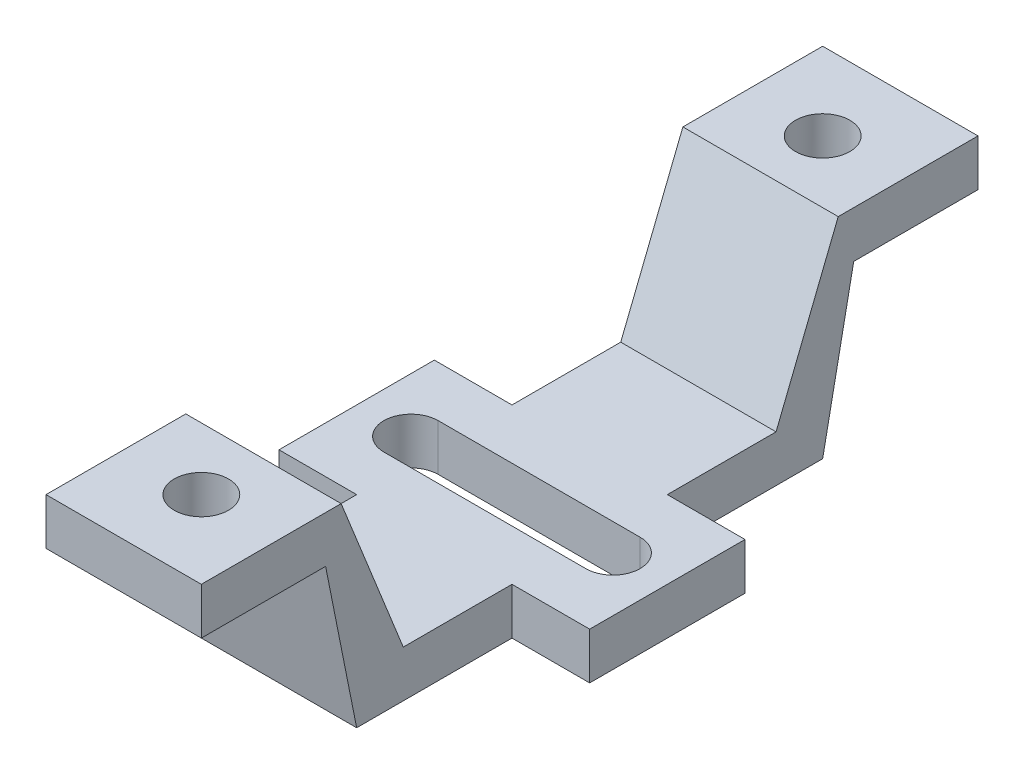
ISO-10303-21;
HEADER;
FILE_DESCRIPTION(('STEP AP214'),'2;1');
FILE_NAME('part.step','',(''),(''),'','','');
FILE_SCHEMA(('AUTOMOTIVE_DESIGN { 1 0 10303 214 1 1 1 1 }'));
ENDSEC;
DATA;
#1=APPLICATION_CONTEXT('core data for automotive mechanical design processes');
#2=APPLICATION_PROTOCOL_DEFINITION('international standard','automotive_design',2000,#1);
#3=PRODUCT_CONTEXT('',#1,'mechanical');
#4=PRODUCT('Part','Part','',(#3));
#5=PRODUCT_RELATED_PRODUCT_CATEGORY('part','',(#4));
#6=PRODUCT_DEFINITION_FORMATION('','',#4);
#7=PRODUCT_DEFINITION_CONTEXT('part definition',#1,'design');
#8=PRODUCT_DEFINITION('design','',#6,#7);
#9=PRODUCT_DEFINITION_SHAPE('','',#8);
#10=(LENGTH_UNIT() NAMED_UNIT(*) SI_UNIT(.MILLI.,.METRE.));
#11=(NAMED_UNIT(*) PLANE_ANGLE_UNIT() SI_UNIT($,.RADIAN.));
#12=(NAMED_UNIT(*) SI_UNIT($,.STERADIAN.) SOLID_ANGLE_UNIT());
#13=UNCERTAINTY_MEASURE_WITH_UNIT(LENGTH_MEASURE(1.E-05),#10,'distance_accuracy_value','');
#14=(GEOMETRIC_REPRESENTATION_CONTEXT(3) GLOBAL_UNCERTAINTY_ASSIGNED_CONTEXT((#13)) GLOBAL_UNIT_ASSIGNED_CONTEXT((#10,
#11,#12)) REPRESENTATION_CONTEXT('',''));
#15=CARTESIAN_POINT('',(0.,0.,0.));
#16=DIRECTION('',(0.,0.,1.));
#17=DIRECTION('',(1.,0.,0.));
#18=AXIS2_PLACEMENT_3D('',#15,#16,#17);
#19=CARTESIAN_POINT('',(0.,3.,-5.));
#20=DIRECTION('',(0.,0.,1.));
#21=DIRECTION('',(1.,0.,0.));
#22=AXIS2_PLACEMENT_3D('',#19,#20,#21);
#23=PLANE('',#22);
#24=DIRECTION('',(0.,1.,0.));
#25=VECTOR('',#24,1.);
#26=CARTESIAN_POINT('',(-5.,0.,-5.));
#27=LINE('',#26,#25);
#28=CARTESIAN_POINT('',(-5.,0.,-5.));
#29=VERTEX_POINT('',#28);
#30=CARTESIAN_POINT('',(-5.,3.,-5.));
#31=VERTEX_POINT('',#30);
#32=EDGE_CURVE('E248',#29,#31,#27,.T.);
#33=ORIENTED_EDGE('',*,*,#32,.F.);
#34=DIRECTION('',(-1.,0.,0.));
#35=VECTOR('',#34,1.);
#36=CARTESIAN_POINT('',(0.,0.,-5.));
#37=LINE('',#36,#35);
#38=CARTESIAN_POINT('',(-10.,0.,-5.));
#39=VERTEX_POINT('',#38);
#40=EDGE_CURVE('E361',#29,#39,#37,.T.);
#41=ORIENTED_EDGE('',*,*,#40,.T.);
#42=DIRECTION('',(0.,-1.,0.));
#43=VECTOR('',#42,1.);
#44=CARTESIAN_POINT('',(-10.,3.,-5.));
#45=LINE('',#44,#43);
#46=CARTESIAN_POINT('',(-10.,3.,-5.));
#47=VERTEX_POINT('',#46);
#48=EDGE_CURVE('E11',#47,#39,#45,.T.);
#49=ORIENTED_EDGE('',*,*,#48,.F.);
#50=DIRECTION('',(-1.,0.,0.));
#51=VECTOR('',#50,1.);
#52=CARTESIAN_POINT('',(0.,3.,-5.));
#53=LINE('',#52,#51);
#54=EDGE_CURVE('E335',#31,#47,#53,.T.);
#55=ORIENTED_EDGE('',*,*,#54,.F.);
#56=EDGE_LOOP('',(#33,#41,#49,#55));
#57=FACE_BOUND('',#56,.T.);
#58=ADVANCED_FACE('F39',(#57),#23,.F.);
#59=CARTESIAN_POINT('',(0.,3.,5.));
#60=DIRECTION('',(0.,0.,1.));
#61=DIRECTION('',(1.,0.,0.));
#62=AXIS2_PLACEMENT_3D('',#59,#60,#61);
#63=PLANE('',#62);
#64=DIRECTION('',(-1.,0.,0.));
#65=VECTOR('',#64,1.);
#66=CARTESIAN_POINT('',(0.,3.,5.));
#67=LINE('',#66,#65);
#68=CARTESIAN_POINT('',(10.,3.,5.));
#69=VERTEX_POINT('',#68);
#70=CARTESIAN_POINT('',(5.,3.,5.));
#71=VERTEX_POINT('',#70);
#72=EDGE_CURVE('E343',#69,#71,#67,.T.);
#73=ORIENTED_EDGE('',*,*,#72,.T.);
#74=DIRECTION('',(0.,-1.,0.));
#75=VECTOR('',#74,1.);
#76=CARTESIAN_POINT('',(5.,0.,5.));
#77=LINE('',#76,#75);
#78=CARTESIAN_POINT('',(5.,0.,5.));
#79=VERTEX_POINT('',#78);
#80=EDGE_CURVE('E277',#71,#79,#77,.T.);
#81=ORIENTED_EDGE('',*,*,#80,.T.);
#82=DIRECTION('',(-1.,0.,0.));
#83=VECTOR('',#82,1.);
#84=CARTESIAN_POINT('',(0.,0.,5.));
#85=LINE('',#84,#83);
#86=CARTESIAN_POINT('',(10.,0.,5.));
#87=VERTEX_POINT('',#86);
#88=EDGE_CURVE('E369',#87,#79,#85,.T.);
#89=ORIENTED_EDGE('',*,*,#88,.F.);
#90=DIRECTION('',(0.,-1.,0.));
#91=VECTOR('',#90,1.);
#92=CARTESIAN_POINT('',(10.,3.,5.));
#93=LINE('',#92,#91);
#94=EDGE_CURVE('E376',#69,#87,#93,.T.);
#95=ORIENTED_EDGE('',*,*,#94,.F.);
#96=EDGE_LOOP('',(#73,#81,#89,#95));
#97=FACE_BOUND('',#96,.T.);
#98=ADVANCED_FACE('F476',(#97),#63,.T.);
#99=CARTESIAN_POINT('',(10.,0.,-5.));
#100=VERTEX_POINT('',#99);
#101=CARTESIAN_POINT('',(5.,0.,-5.));
#102=VERTEX_POINT('',#101);
#103=EDGE_CURVE('E362',#100,#102,#37,.T.);
#104=ORIENTED_EDGE('',*,*,#103,.T.);
#105=DIRECTION('',(0.,1.,0.));
#106=VECTOR('',#105,1.);
#107=CARTESIAN_POINT('',(5.,0.,-5.));
#108=LINE('',#107,#106);
#109=CARTESIAN_POINT('',(5.,3.,-5.));
#110=VERTEX_POINT('',#109);
#111=EDGE_CURVE('E227',#102,#110,#108,.T.);
#112=ORIENTED_EDGE('',*,*,#111,.T.);
#113=CARTESIAN_POINT('',(10.,3.,-5.));
#114=VERTEX_POINT('',#113);
#115=EDGE_CURVE('E336',#114,#110,#53,.T.);
#116=ORIENTED_EDGE('',*,*,#115,.F.);
#117=DIRECTION('',(0.,-1.,0.));
#118=VECTOR('',#117,1.);
#119=CARTESIAN_POINT('',(10.,3.,-5.));
#120=LINE('',#119,#118);
#121=EDGE_CURVE('E374',#114,#100,#120,.T.);
#122=ORIENTED_EDGE('',*,*,#121,.T.);
#123=EDGE_LOOP('',(#104,#112,#116,#122));
#124=FACE_BOUND('',#123,.T.);
#125=ADVANCED_FACE('F415',(#124),#23,.F.);
#126=CARTESIAN_POINT('',(-10.,3.,0.));
#127=DIRECTION('',(1.,0.,0.));
#128=DIRECTION('',(0.,0.,-1.));
#129=AXIS2_PLACEMENT_3D('',#126,#127,#128);
#130=PLANE('',#129);
#131=DIRECTION('',(0.,0.,1.));
#132=VECTOR('',#131,1.);
#133=CARTESIAN_POINT('',(-10.,0.,0.));
#134=LINE('',#133,#132);
#135=CARTESIAN_POINT('',(-9.99999999999999,0.,5.));
#136=VERTEX_POINT('',#135);
#137=EDGE_CURVE('E365',#39,#136,#134,.T.);
#138=ORIENTED_EDGE('',*,*,#137,.T.);
#139=DIRECTION('',(0.,-1.,0.));
#140=VECTOR('',#139,1.);
#141=CARTESIAN_POINT('',(-9.99999999999999,3.,5.));
#142=LINE('',#141,#140);
#143=CARTESIAN_POINT('',(-9.99999999999999,3.,5.));
#144=VERTEX_POINT('',#143);
#145=EDGE_CURVE('E48',#144,#136,#142,.T.);
#146=ORIENTED_EDGE('',*,*,#145,.F.);
#147=DIRECTION('',(0.,0.,1.));
#148=VECTOR('',#147,1.);
#149=CARTESIAN_POINT('',(-10.,3.,0.));
#150=LINE('',#149,#148);
#151=EDGE_CURVE('E339',#47,#144,#150,.T.);
#152=ORIENTED_EDGE('',*,*,#151,.F.);
#153=ORIENTED_EDGE('',*,*,#48,.T.);
#154=EDGE_LOOP('',(#138,#146,#152,#153));
#155=FACE_BOUND('',#154,.T.);
#156=ADVANCED_FACE('F440',(#155),#130,.F.);
#157=DIRECTION('',(0.,-1.,0.));
#158=VECTOR('',#157,1.);
#159=CARTESIAN_POINT('',(-5.,0.,5.));
#160=LINE('',#159,#158);
#161=CARTESIAN_POINT('',(-5.,3.,5.));
#162=VERTEX_POINT('',#161);
#163=CARTESIAN_POINT('',(-5.,0.,5.));
#164=VERTEX_POINT('',#163);
#165=EDGE_CURVE('E297',#162,#164,#160,.T.);
#166=ORIENTED_EDGE('',*,*,#165,.F.);
#167=EDGE_CURVE('E342',#162,#144,#67,.T.);
#168=ORIENTED_EDGE('',*,*,#167,.T.);
#169=ORIENTED_EDGE('',*,*,#145,.T.);
#170=EDGE_CURVE('E368',#164,#136,#85,.T.);
#171=ORIENTED_EDGE('',*,*,#170,.F.);
#172=EDGE_LOOP('',(#166,#168,#169,#171));
#173=FACE_BOUND('',#172,.T.);
#174=ADVANCED_FACE('F446',(#173),#63,.T.);
#175=CARTESIAN_POINT('',(6.5,3.,0.));
#176=DIRECTION('',(0.,-1.,0.));
#177=DIRECTION('',(0.,0.,-1.));
#178=AXIS2_PLACEMENT_3D('',#175,#176,#177);
#179=CYLINDRICAL_SURFACE('',#178,1.75);
#180=CARTESIAN_POINT('',(6.5,0.,0.));
#181=DIRECTION('',(0.,1.,0.));
#182=DIRECTION('',(0.,0.,1.));
#183=AXIS2_PLACEMENT_3D('',#180,#181,#182);
#184=CIRCLE('',#183,1.75);
#185=CARTESIAN_POINT('',(6.5,0.,1.75));
#186=VERTEX_POINT('',#185);
#187=CARTESIAN_POINT('',(6.5,0.,-1.75));
#188=VERTEX_POINT('',#187);
#189=EDGE_CURVE('E323',#186,#188,#184,.T.);
#190=ORIENTED_EDGE('',*,*,#189,.F.);
#191=DIRECTION('',(0.,-1.,0.));
#192=VECTOR('',#191,1.);
#193=CARTESIAN_POINT('',(6.5,3.,1.75));
#194=LINE('',#193,#192);
#195=CARTESIAN_POINT('',(6.5,3.,1.75));
#196=VERTEX_POINT('',#195);
#197=EDGE_CURVE('E377',#196,#186,#194,.T.);
#198=ORIENTED_EDGE('',*,*,#197,.F.);
#199=CARTESIAN_POINT('',(6.5,3.,0.));
#200=DIRECTION('',(0.,1.,0.));
#201=DIRECTION('',(0.,0.,1.));
#202=AXIS2_PLACEMENT_3D('',#199,#200,#201);
#203=CIRCLE('',#202,1.75);
#204=CARTESIAN_POINT('',(6.5,3.,-1.75));
#205=VERTEX_POINT('',#204);
#206=EDGE_CURVE('E324',#196,#205,#203,.T.);
#207=ORIENTED_EDGE('',*,*,#206,.T.);
#208=DIRECTION('',(0.,-1.,0.));
#209=VECTOR('',#208,1.);
#210=CARTESIAN_POINT('',(6.5,3.,-1.75));
#211=LINE('',#210,#209);
#212=EDGE_CURVE('E349',#205,#188,#211,.T.);
#213=ORIENTED_EDGE('',*,*,#212,.T.);
#214=EDGE_LOOP('',(#190,#198,#207,#213));
#215=FACE_BOUND('',#214,.T.);
#216=ADVANCED_FACE('F41',(#215),#179,.F.);
#217=CARTESIAN_POINT('',(0.,3.,1.75));
#218=DIRECTION('',(0.,0.,1.));
#219=DIRECTION('',(1.,0.,0.));
#220=AXIS2_PLACEMENT_3D('',#217,#218,#219);
#221=PLANE('',#220);
#222=DIRECTION('',(-1.,0.,0.));
#223=VECTOR('',#222,1.);
#224=CARTESIAN_POINT('',(0.,0.,1.75));
#225=LINE('',#224,#223);
#226=CARTESIAN_POINT('',(-6.5,0.,1.75));
#227=VERTEX_POINT('',#226);
#228=EDGE_CURVE('E352',#186,#227,#225,.T.);
#229=ORIENTED_EDGE('',*,*,#228,.T.);
#230=DIRECTION('',(0.,-1.,0.));
#231=VECTOR('',#230,1.);
#232=CARTESIAN_POINT('',(-6.5,3.,1.75));
#233=LINE('',#232,#231);
#234=CARTESIAN_POINT('',(-6.5,3.,1.75));
#235=VERTEX_POINT('',#234);
#236=EDGE_CURVE('E384',#235,#227,#233,.T.);
#237=ORIENTED_EDGE('',*,*,#236,.F.);
#238=DIRECTION('',(-1.,0.,0.));
#239=VECTOR('',#238,1.);
#240=CARTESIAN_POINT('',(0.,3.,1.75));
#241=LINE('',#240,#239);
#242=EDGE_CURVE('E327',#196,#235,#241,.T.);
#243=ORIENTED_EDGE('',*,*,#242,.F.);
#244=ORIENTED_EDGE('',*,*,#197,.T.);
#245=EDGE_LOOP('',(#229,#237,#243,#244));
#246=FACE_BOUND('',#245,.T.);
#247=ADVANCED_FACE('F388',(#246),#221,.F.);
#248=CARTESIAN_POINT('',(-6.5,3.,0.));
#249=DIRECTION('',(0.,-1.,0.));
#250=DIRECTION('',(0.,0.,-1.));
#251=AXIS2_PLACEMENT_3D('',#248,#249,#250);
#252=CYLINDRICAL_SURFACE('',#251,1.75);
#253=CARTESIAN_POINT('',(-6.5,0.,0.));
#254=DIRECTION('',(0.,1.,0.));
#255=DIRECTION('',(0.,0.,1.));
#256=AXIS2_PLACEMENT_3D('',#253,#254,#255);
#257=CIRCLE('',#256,1.75);
#258=CARTESIAN_POINT('',(-6.5,0.,-1.75));
#259=VERTEX_POINT('',#258);
#260=EDGE_CURVE('E355',#259,#227,#257,.T.);
#261=ORIENTED_EDGE('',*,*,#260,.F.);
#262=DIRECTION('',(0.,-1.,0.));
#263=VECTOR('',#262,1.);
#264=CARTESIAN_POINT('',(-6.5,3.,-1.75));
#265=LINE('',#264,#263);
#266=CARTESIAN_POINT('',(-6.5,3.,-1.75));
#267=VERTEX_POINT('',#266);
#268=EDGE_CURVE('E382',#267,#259,#265,.T.);
#269=ORIENTED_EDGE('',*,*,#268,.F.);
#270=CARTESIAN_POINT('',(-6.5,3.,0.));
#271=DIRECTION('',(0.,1.,0.));
#272=DIRECTION('',(0.,0.,1.));
#273=AXIS2_PLACEMENT_3D('',#270,#271,#272);
#274=CIRCLE('',#273,1.75);
#275=EDGE_CURVE('E330',#267,#235,#274,.T.);
#276=ORIENTED_EDGE('',*,*,#275,.T.);
#277=ORIENTED_EDGE('',*,*,#236,.T.);
#278=EDGE_LOOP('',(#261,#269,#276,#277));
#279=FACE_BOUND('',#278,.T.);
#280=ADVANCED_FACE('F403',(#279),#252,.F.);
#281=CARTESIAN_POINT('',(0.,3.,-1.75));
#282=DIRECTION('',(0.,0.,-1.));
#283=DIRECTION('',(-1.,0.,0.));
#284=AXIS2_PLACEMENT_3D('',#281,#282,#283);
#285=PLANE('',#284);
#286=DIRECTION('',(1.,0.,0.));
#287=VECTOR('',#286,1.);
#288=CARTESIAN_POINT('',(0.,0.,-1.75));
#289=LINE('',#288,#287);
#290=EDGE_CURVE('E358',#259,#188,#289,.T.);
#291=ORIENTED_EDGE('',*,*,#290,.T.);
#292=ORIENTED_EDGE('',*,*,#212,.F.);
#293=DIRECTION('',(1.,0.,0.));
#294=VECTOR('',#293,1.);
#295=CARTESIAN_POINT('',(0.,3.,-1.75));
#296=LINE('',#295,#294);
#297=EDGE_CURVE('E333',#267,#205,#296,.T.);
#298=ORIENTED_EDGE('',*,*,#297,.F.);
#299=ORIENTED_EDGE('',*,*,#268,.T.);
#300=EDGE_LOOP('',(#291,#292,#298,#299));
#301=FACE_BOUND('',#300,.T.);
#302=ADVANCED_FACE('F401',(#301),#285,.F.);
#303=CARTESIAN_POINT('',(10.,3.,0.));
#304=DIRECTION('',(1.,0.,0.));
#305=DIRECTION('',(0.,0.,-1.));
#306=AXIS2_PLACEMENT_3D('',#303,#304,#305);
#307=PLANE('',#306);
#308=DIRECTION('',(0.,0.,1.));
#309=VECTOR('',#308,1.);
#310=CARTESIAN_POINT('',(10.,0.,0.));
#311=LINE('',#310,#309);
#312=EDGE_CURVE('E328',#100,#87,#311,.T.);
#313=ORIENTED_EDGE('',*,*,#312,.F.);
#314=ORIENTED_EDGE('',*,*,#121,.F.);
#315=DIRECTION('',(0.,0.,1.));
#316=VECTOR('',#315,1.);
#317=CARTESIAN_POINT('',(10.,3.,0.));
#318=LINE('',#317,#316);
#319=EDGE_CURVE('E346',#114,#69,#318,.T.);
#320=ORIENTED_EDGE('',*,*,#319,.T.);
#321=ORIENTED_EDGE('',*,*,#94,.T.);
#322=EDGE_LOOP('',(#313,#314,#320,#321));
#323=FACE_BOUND('',#322,.T.);
#324=ADVANCED_FACE('F409',(#323),#307,.T.);
#325=CARTESIAN_POINT('',(0.,3.,0.));
#326=DIRECTION('',(0.,1.,0.));
#327=DIRECTION('',(0.,0.,1.));
#328=AXIS2_PLACEMENT_3D('',#325,#326,#327);
#329=PLANE('',#328);
#330=ORIENTED_EDGE('',*,*,#206,.F.);
#331=ORIENTED_EDGE('',*,*,#242,.T.);
#332=ORIENTED_EDGE('',*,*,#275,.F.);
#333=ORIENTED_EDGE('',*,*,#297,.T.);
#334=EDGE_LOOP('',(#330,#331,#332,#333));
#335=FACE_BOUND('',#334,.T.);
#336=ORIENTED_EDGE('',*,*,#115,.T.);
#337=DIRECTION('',(0.,0.,-1.));
#338=VECTOR('',#337,1.);
#339=CARTESIAN_POINT('',(5.,3.,0.));
#340=LINE('',#339,#338);
#341=CARTESIAN_POINT('',(5.,3.,-12.));
#342=VERTEX_POINT('',#341);
#343=EDGE_CURVE('E56',#110,#342,#340,.T.);
#344=ORIENTED_EDGE('',*,*,#343,.T.);
#345=DIRECTION('',(-1.,0.,0.));
#346=VECTOR('',#345,1.);
#347=CARTESIAN_POINT('',(5.,3.,-12.));
#348=LINE('',#347,#346);
#349=CARTESIAN_POINT('',(-5.,3.,-12.));
#350=VERTEX_POINT('',#349);
#351=EDGE_CURVE('E216',#342,#350,#348,.T.);
#352=ORIENTED_EDGE('',*,*,#351,.T.);
#353=DIRECTION('',(0.,0.,-1.));
#354=VECTOR('',#353,1.);
#355=CARTESIAN_POINT('',(-5.,3.,0.));
#356=LINE('',#355,#354);
#357=EDGE_CURVE('E245',#31,#350,#356,.T.);
#358=ORIENTED_EDGE('',*,*,#357,.F.);
#359=ORIENTED_EDGE('',*,*,#54,.T.);
#360=ORIENTED_EDGE('',*,*,#151,.T.);
#361=ORIENTED_EDGE('',*,*,#167,.F.);
#362=DIRECTION('',(0.,0.,-1.));
#363=VECTOR('',#362,1.);
#364=CARTESIAN_POINT('',(-5.,3.,0.));
#365=LINE('',#364,#363);
#366=CARTESIAN_POINT('',(-5.,3.,12.));
#367=VERTEX_POINT('',#366);
#368=EDGE_CURVE('E300',#367,#162,#365,.T.);
#369=ORIENTED_EDGE('',*,*,#368,.F.);
#370=DIRECTION('',(-1.,0.,0.));
#371=VECTOR('',#370,1.);
#372=CARTESIAN_POINT('',(5.,3.,12.));
#373=LINE('',#372,#371);
#374=CARTESIAN_POINT('',(5.,3.,12.));
#375=VERTEX_POINT('',#374);
#376=EDGE_CURVE('E315',#375,#367,#373,.T.);
#377=ORIENTED_EDGE('',*,*,#376,.F.);
#378=DIRECTION('',(0.,0.,-1.));
#379=VECTOR('',#378,1.);
#380=CARTESIAN_POINT('',(5.,3.,0.));
#381=LINE('',#380,#379);
#382=EDGE_CURVE('E279',#375,#71,#381,.T.);
#383=ORIENTED_EDGE('',*,*,#382,.T.);
#384=ORIENTED_EDGE('',*,*,#72,.F.);
#385=ORIENTED_EDGE('',*,*,#319,.F.);
#386=EDGE_LOOP('',(#336,#344,#352,#358,#359,#360,#361,#369,#377,#383,#384,#385));
#387=FACE_BOUND('',#386,.T.);
#388=ADVANCED_FACE('F406',(#335,#387),#329,.T.);
#389=CARTESIAN_POINT('',(0.,0.,0.));
#390=DIRECTION('',(0.,1.,0.));
#391=DIRECTION('',(0.,0.,1.));
#392=AXIS2_PLACEMENT_3D('',#389,#390,#391);
#393=PLANE('',#392);
#394=ORIENTED_EDGE('',*,*,#189,.T.);
#395=ORIENTED_EDGE('',*,*,#290,.F.);
#396=ORIENTED_EDGE('',*,*,#260,.T.);
#397=ORIENTED_EDGE('',*,*,#228,.F.);
#398=EDGE_LOOP('',(#394,#395,#396,#397));
#399=FACE_BOUND('',#398,.T.);
#400=ORIENTED_EDGE('',*,*,#103,.F.);
#401=ORIENTED_EDGE('',*,*,#312,.T.);
#402=ORIENTED_EDGE('',*,*,#88,.T.);
#403=DIRECTION('',(0.,0.,-1.));
#404=VECTOR('',#403,1.);
#405=CARTESIAN_POINT('',(5.,0.,0.));
#406=LINE('',#405,#404);
#407=CARTESIAN_POINT('',(5.,0.,15.));
#408=VERTEX_POINT('',#407);
#409=EDGE_CURVE('E64',#408,#79,#406,.T.);
#410=ORIENTED_EDGE('',*,*,#409,.F.);
#411=DIRECTION('',(-1.,0.,0.));
#412=VECTOR('',#411,1.);
#413=CARTESIAN_POINT('',(5.,0.,15.));
#414=LINE('',#413,#412);
#415=CARTESIAN_POINT('',(-5.,0.,15.));
#416=VERTEX_POINT('',#415);
#417=EDGE_CURVE('E317',#408,#416,#414,.T.);
#418=ORIENTED_EDGE('',*,*,#417,.T.);
#419=DIRECTION('',(0.,0.,-1.));
#420=VECTOR('',#419,1.);
#421=CARTESIAN_POINT('',(-5.,0.,0.));
#422=LINE('',#421,#420);
#423=EDGE_CURVE('E295',#416,#164,#422,.T.);
#424=ORIENTED_EDGE('',*,*,#423,.T.);
#425=ORIENTED_EDGE('',*,*,#170,.T.);
#426=ORIENTED_EDGE('',*,*,#137,.F.);
#427=ORIENTED_EDGE('',*,*,#40,.F.);
#428=DIRECTION('',(0.,0.,-1.));
#429=VECTOR('',#428,1.);
#430=CARTESIAN_POINT('',(-5.,0.,0.));
#431=LINE('',#430,#429);
#432=CARTESIAN_POINT('',(-5.,0.,-15.));
#433=VERTEX_POINT('',#432);
#434=EDGE_CURVE('E251',#29,#433,#431,.T.);
#435=ORIENTED_EDGE('',*,*,#434,.T.);
#436=DIRECTION('',(-1.,0.,0.));
#437=VECTOR('',#436,1.);
#438=CARTESIAN_POINT('',(5.,0.,-15.));
#439=LINE('',#438,#437);
#440=CARTESIAN_POINT('',(5.,0.,-15.));
#441=VERTEX_POINT('',#440);
#442=EDGE_CURVE('E266',#441,#433,#439,.T.);
#443=ORIENTED_EDGE('',*,*,#442,.F.);
#444=DIRECTION('',(0.,0.,-1.));
#445=VECTOR('',#444,1.);
#446=CARTESIAN_POINT('',(5.,0.,0.));
#447=LINE('',#446,#445);
#448=EDGE_CURVE('E232',#102,#441,#447,.T.);
#449=ORIENTED_EDGE('',*,*,#448,.F.);
#450=EDGE_LOOP('',(#400,#401,#402,#410,#418,#424,#425,#426,#427,#435,#443,#449));
#451=FACE_BOUND('',#450,.T.);
#452=ADVANCED_FACE('F394',(#399,#451),#393,.F.);
#453=CARTESIAN_POINT('',(5.,10.,0.));
#454=DIRECTION('',(0.,1.,0.));
#455=DIRECTION('',(0.,0.,1.));
#456=AXIS2_PLACEMENT_3D('',#453,#454,#455);
#457=PLANE('',#456);
#458=CARTESIAN_POINT('',(0.,10.,20.));
#459=DIRECTION('',(0.,1.,0.));
#460=DIRECTION('',(0.,0.,1.));
#461=AXIS2_PLACEMENT_3D('',#458,#459,#460);
#462=CIRCLE('',#461,1.75);
#463=CARTESIAN_POINT('',(0.,10.,21.75));
#464=VERTEX_POINT('',#463);
#465=EDGE_CURVE('E243',#464,#464,#462,.T.);
#466=ORIENTED_EDGE('',*,*,#465,.T.);
#467=EDGE_LOOP('',(#466));
#468=FACE_BOUND('',#467,.T.);
#469=DIRECTION('',(0.,0.,-1.));
#470=VECTOR('',#469,1.);
#471=CARTESIAN_POINT('',(-5.,10.,0.));
#472=LINE('',#471,#470);
#473=CARTESIAN_POINT('',(-5.,10.,25.));
#474=VERTEX_POINT('',#473);
#475=CARTESIAN_POINT('',(-5.,10.,17.));
#476=VERTEX_POINT('',#475);
#477=EDGE_CURVE('E215',#474,#476,#472,.T.);
#478=ORIENTED_EDGE('',*,*,#477,.T.);
#479=DIRECTION('',(-1.,0.,0.));
#480=VECTOR('',#479,1.);
#481=CARTESIAN_POINT('',(5.,10.,17.));
#482=LINE('',#481,#480);
#483=CARTESIAN_POINT('',(5.,10.,17.));
#484=VERTEX_POINT('',#483);
#485=EDGE_CURVE('E320',#484,#476,#482,.T.);
#486=ORIENTED_EDGE('',*,*,#485,.F.);
#487=DIRECTION('',(0.,0.,-1.));
#488=VECTOR('',#487,1.);
#489=CARTESIAN_POINT('',(5.,10.,0.));
#490=LINE('',#489,#488);
#491=CARTESIAN_POINT('',(5.,10.,25.));
#492=VERTEX_POINT('',#491);
#493=EDGE_CURVE('E270',#492,#484,#490,.T.);
#494=ORIENTED_EDGE('',*,*,#493,.F.);
#495=DIRECTION('',(-1.,0.,0.));
#496=VECTOR('',#495,1.);
#497=CARTESIAN_POINT('',(5.,10.,25.));
#498=LINE('',#497,#496);
#499=EDGE_CURVE('E290',#492,#474,#498,.T.);
#500=ORIENTED_EDGE('',*,*,#499,.T.);
#501=EDGE_LOOP('',(#478,#486,#494,#500));
#502=FACE_BOUND('',#501,.T.);
#503=ADVANCED_FACE('F470',(#468,#502),#457,.F.);
#504=CARTESIAN_POINT('',(5.,-2.88461538461539,14.4230769230769));
#505=DIRECTION('',(0.,0.196116135138184,-0.98058067569092));
#506=DIRECTION('',(0.,0.98058067569092,0.196116135138184));
#507=AXIS2_PLACEMENT_3D('',#504,#505,#506);
#508=PLANE('',#507);
#509=DIRECTION('',(0.,-0.98058067569092,-0.196116135138184));
#510=VECTOR('',#509,1.);
#511=CARTESIAN_POINT('',(-5.,-2.88461538461539,14.4230769230769));
#512=LINE('',#511,#510);
#513=EDGE_CURVE('E293',#476,#416,#512,.T.);
#514=ORIENTED_EDGE('',*,*,#513,.T.);
#515=ORIENTED_EDGE('',*,*,#417,.F.);
#516=DIRECTION('',(0.,-0.98058067569092,-0.196116135138184));
#517=VECTOR('',#516,1.);
#518=CARTESIAN_POINT('',(5.,-2.88461538461539,14.4230769230769));
#519=LINE('',#518,#517);
#520=EDGE_CURVE('E273',#484,#408,#519,.T.);
#521=ORIENTED_EDGE('',*,*,#520,.F.);
#522=ORIENTED_EDGE('',*,*,#485,.T.);
#523=EDGE_LOOP('',(#514,#515,#521,#522));
#524=FACE_BOUND('',#523,.T.);
#525=ADVANCED_FACE('F472',(#524),#508,.F.);
#526=CARTESIAN_POINT('',(5.,-3.72413793103448,9.3103448275862));
#527=DIRECTION('',(0.,0.371390676354104,-0.928476690885259));
#528=DIRECTION('',(0.,0.928476690885259,0.371390676354104));
#529=AXIS2_PLACEMENT_3D('',#526,#527,#528);
#530=PLANE('',#529);
#531=DIRECTION('',(0.,-0.928476690885259,-0.371390676354104));
#532=VECTOR('',#531,1.);
#533=CARTESIAN_POINT('',(-5.,-3.72413793103448,9.3103448275862));
#534=LINE('',#533,#532);
#535=CARTESIAN_POINT('',(-5.,13.,16.));
#536=VERTEX_POINT('',#535);
#537=EDGE_CURVE('E302',#536,#367,#534,.T.);
#538=ORIENTED_EDGE('',*,*,#537,.F.);
#539=DIRECTION('',(-1.,0.,0.));
#540=VECTOR('',#539,1.);
#541=CARTESIAN_POINT('',(5.,13.,16.));
#542=LINE('',#541,#540);
#543=CARTESIAN_POINT('',(5.,13.,16.));
#544=VERTEX_POINT('',#543);
#545=EDGE_CURVE('E313',#544,#536,#542,.T.);
#546=ORIENTED_EDGE('',*,*,#545,.F.);
#547=DIRECTION('',(0.,-0.928476690885259,-0.371390676354104));
#548=VECTOR('',#547,1.);
#549=CARTESIAN_POINT('',(5.,-3.72413793103448,9.3103448275862));
#550=LINE('',#549,#548);
#551=EDGE_CURVE('E282',#544,#375,#550,.T.);
#552=ORIENTED_EDGE('',*,*,#551,.T.);
#553=ORIENTED_EDGE('',*,*,#376,.T.);
#554=EDGE_LOOP('',(#538,#546,#552,#553));
#555=FACE_BOUND('',#554,.T.);
#556=ADVANCED_FACE('F456',(#555),#530,.T.);
#557=CARTESIAN_POINT('',(5.,13.,0.));
#558=DIRECTION('',(0.,1.,0.));
#559=DIRECTION('',(0.,0.,1.));
#560=AXIS2_PLACEMENT_3D('',#557,#558,#559);
#561=PLANE('',#560);
#562=CARTESIAN_POINT('',(0.,13.,20.));
#563=DIRECTION('',(0.,1.,0.));
#564=DIRECTION('',(0.,0.,1.));
#565=AXIS2_PLACEMENT_3D('',#562,#563,#564);
#566=CIRCLE('',#565,1.75);
#567=CARTESIAN_POINT('',(0.,13.,21.75));
#568=VERTEX_POINT('',#567);
#569=EDGE_CURVE('E849',#568,#568,#566,.T.);
#570=ORIENTED_EDGE('',*,*,#569,.F.);
#571=EDGE_LOOP('',(#570));
#572=FACE_BOUND('',#571,.T.);
#573=DIRECTION('',(0.,0.,-1.));
#574=VECTOR('',#573,1.);
#575=CARTESIAN_POINT('',(-5.,13.,0.));
#576=LINE('',#575,#574);
#577=CARTESIAN_POINT('',(-5.,13.,25.));
#578=VERTEX_POINT('',#577);
#579=EDGE_CURVE('E305',#578,#536,#576,.T.);
#580=ORIENTED_EDGE('',*,*,#579,.F.);
#581=DIRECTION('',(-1.,0.,0.));
#582=VECTOR('',#581,1.);
#583=CARTESIAN_POINT('',(5.,13.,25.));
#584=LINE('',#583,#582);
#585=CARTESIAN_POINT('',(5.,13.,25.));
#586=VERTEX_POINT('',#585);
#587=EDGE_CURVE('E311',#586,#578,#584,.T.);
#588=ORIENTED_EDGE('',*,*,#587,.F.);
#589=DIRECTION('',(0.,0.,-1.));
#590=VECTOR('',#589,1.);
#591=CARTESIAN_POINT('',(5.,13.,0.));
#592=LINE('',#591,#590);
#593=EDGE_CURVE('E285',#586,#544,#592,.T.);
#594=ORIENTED_EDGE('',*,*,#593,.T.);
#595=ORIENTED_EDGE('',*,*,#545,.T.);
#596=EDGE_LOOP('',(#580,#588,#594,#595));
#597=FACE_BOUND('',#596,.T.);
#598=ADVANCED_FACE('F461',(#572,#597),#561,.T.);
#599=CARTESIAN_POINT('',(5.,0.,25.));
#600=DIRECTION('',(0.,0.,-1.));
#601=DIRECTION('',(-1.,0.,0.));
#602=AXIS2_PLACEMENT_3D('',#599,#600,#601);
#603=PLANE('',#602);
#604=DIRECTION('',(0.,-1.,0.));
#605=VECTOR('',#604,1.);
#606=CARTESIAN_POINT('',(-5.,0.,25.));
#607=LINE('',#606,#605);
#608=EDGE_CURVE('E274',#578,#474,#607,.T.);
#609=ORIENTED_EDGE('',*,*,#608,.T.);
#610=ORIENTED_EDGE('',*,*,#499,.F.);
#611=DIRECTION('',(0.,-1.,0.));
#612=VECTOR('',#611,1.);
#613=CARTESIAN_POINT('',(5.,0.,25.));
#614=LINE('',#613,#612);
#615=EDGE_CURVE('E288',#586,#492,#614,.T.);
#616=ORIENTED_EDGE('',*,*,#615,.F.);
#617=ORIENTED_EDGE('',*,*,#587,.T.);
#618=EDGE_LOOP('',(#609,#610,#616,#617));
#619=FACE_BOUND('',#618,.T.);
#620=ADVANCED_FACE('F465',(#619),#603,.F.);
#621=CARTESIAN_POINT('',(5.,0.,0.));
#622=DIRECTION('',(1.,0.,0.));
#623=DIRECTION('',(0.,0.,-1.));
#624=AXIS2_PLACEMENT_3D('',#621,#622,#623);
#625=PLANE('',#624);
#626=ORIENTED_EDGE('',*,*,#493,.T.);
#627=ORIENTED_EDGE('',*,*,#520,.T.);
#628=ORIENTED_EDGE('',*,*,#409,.T.);
#629=ORIENTED_EDGE('',*,*,#80,.F.);
#630=ORIENTED_EDGE('',*,*,#382,.F.);
#631=ORIENTED_EDGE('',*,*,#551,.F.);
#632=ORIENTED_EDGE('',*,*,#593,.F.);
#633=ORIENTED_EDGE('',*,*,#615,.T.);
#634=EDGE_LOOP('',(#626,#627,#628,#629,#630,#631,#632,#633));
#635=FACE_BOUND('',#634,.T.);
#636=ADVANCED_FACE('F459',(#635),#625,.T.);
#637=CARTESIAN_POINT('',(-5.,0.,0.));
#638=DIRECTION('',(1.,0.,0.));
#639=DIRECTION('',(0.,0.,-1.));
#640=AXIS2_PLACEMENT_3D('',#637,#638,#639);
#641=PLANE('',#640);
#642=ORIENTED_EDGE('',*,*,#477,.F.);
#643=ORIENTED_EDGE('',*,*,#608,.F.);
#644=ORIENTED_EDGE('',*,*,#579,.T.);
#645=ORIENTED_EDGE('',*,*,#537,.T.);
#646=ORIENTED_EDGE('',*,*,#368,.T.);
#647=ORIENTED_EDGE('',*,*,#165,.T.);
#648=ORIENTED_EDGE('',*,*,#423,.F.);
#649=ORIENTED_EDGE('',*,*,#513,.F.);
#650=EDGE_LOOP('',(#642,#643,#644,#645,#646,#647,#648,#649));
#651=FACE_BOUND('',#650,.T.);
#652=ADVANCED_FACE('F452',(#651),#641,.F.);
#653=CARTESIAN_POINT('',(5.,13.,0.));
#654=DIRECTION('',(0.,1.,0.));
#655=DIRECTION('',(0.,0.,1.));
#656=AXIS2_PLACEMENT_3D('',#653,#654,#655);
#657=PLANE('',#656);
#658=CARTESIAN_POINT('',(0.,13.,-20.));
#659=DIRECTION('',(0.,1.,0.));
#660=DIRECTION('',(0.,0.,1.));
#661=AXIS2_PLACEMENT_3D('',#658,#659,#660);
#662=CIRCLE('',#661,1.75);
#663=CARTESIAN_POINT('',(0.,13.,-18.25));
#664=VERTEX_POINT('',#663);
#665=EDGE_CURVE('E853',#664,#664,#662,.T.);
#666=ORIENTED_EDGE('',*,*,#665,.F.);
#667=EDGE_LOOP('',(#666));
#668=FACE_BOUND('',#667,.T.);
#669=DIRECTION('',(0.,0.,-1.));
#670=VECTOR('',#669,1.);
#671=CARTESIAN_POINT('',(-5.,13.,0.));
#672=LINE('',#671,#670);
#673=CARTESIAN_POINT('',(-5.,13.,-16.));
#674=VERTEX_POINT('',#673);
#675=CARTESIAN_POINT('',(-5.,13.,-25.));
#676=VERTEX_POINT('',#675);
#677=EDGE_CURVE('E210',#674,#676,#672,.T.);
#678=ORIENTED_EDGE('',*,*,#677,.F.);
#679=DIRECTION('',(-1.,0.,0.));
#680=VECTOR('',#679,1.);
#681=CARTESIAN_POINT('',(5.,13.,-16.));
#682=LINE('',#681,#680);
#683=CARTESIAN_POINT('',(5.,13.,-16.));
#684=VERTEX_POINT('',#683);
#685=EDGE_CURVE('E204',#684,#674,#682,.T.);
#686=ORIENTED_EDGE('',*,*,#685,.F.);
#687=DIRECTION('',(0.,0.,-1.));
#688=VECTOR('',#687,1.);
#689=CARTESIAN_POINT('',(5.,13.,0.));
#690=LINE('',#689,#688);
#691=CARTESIAN_POINT('',(5.,13.,-25.));
#692=VERTEX_POINT('',#691);
#693=EDGE_CURVE('E207',#684,#692,#690,.T.);
#694=ORIENTED_EDGE('',*,*,#693,.T.);
#695=DIRECTION('',(-1.,0.,0.));
#696=VECTOR('',#695,1.);
#697=CARTESIAN_POINT('',(5.,13.,-25.));
#698=LINE('',#697,#696);
#699=EDGE_CURVE('E240',#692,#676,#698,.T.);
#700=ORIENTED_EDGE('',*,*,#699,.T.);
#701=EDGE_LOOP('',(#678,#686,#694,#700));
#702=FACE_BOUND('',#701,.T.);
#703=ADVANCED_FACE('F206',(#668,#702),#657,.T.);
#704=CARTESIAN_POINT('',(5.,-3.72413793103448,-9.31034482758621));
#705=DIRECTION('',(0.,0.371390676354104,0.928476690885259));
#706=DIRECTION('',(0.,-0.928476690885259,0.371390676354104));
#707=AXIS2_PLACEMENT_3D('',#704,#705,#706);
#708=PLANE('',#707);
#709=DIRECTION('',(0.,0.928476690885259,-0.371390676354104));
#710=VECTOR('',#709,1.);
#711=CARTESIAN_POINT('',(-5.,-3.72413793103448,-9.31034482758621));
#712=LINE('',#711,#710);
#713=EDGE_CURVE('E242',#350,#674,#712,.T.);
#714=ORIENTED_EDGE('',*,*,#713,.F.);
#715=ORIENTED_EDGE('',*,*,#351,.F.);
#716=DIRECTION('',(0.,0.928476690885259,-0.371390676354104));
#717=VECTOR('',#716,1.);
#718=CARTESIAN_POINT('',(5.,-3.72413793103448,-9.31034482758621));
#719=LINE('',#718,#717);
#720=EDGE_CURVE('E219',#342,#684,#719,.T.);
#721=ORIENTED_EDGE('',*,*,#720,.T.);
#722=ORIENTED_EDGE('',*,*,#685,.T.);
#723=EDGE_LOOP('',(#714,#715,#721,#722));
#724=FACE_BOUND('',#723,.T.);
#725=ADVANCED_FACE('F225',(#724),#708,.T.);
#726=CARTESIAN_POINT('',(5.,-2.88461538461538,-14.4230769230769));
#727=DIRECTION('',(0.,0.196116135138184,0.98058067569092));
#728=DIRECTION('',(0.,-0.98058067569092,0.196116135138184));
#729=AXIS2_PLACEMENT_3D('',#726,#727,#728);
#730=PLANE('',#729);
#731=DIRECTION('',(0.,0.98058067569092,-0.196116135138184));
#732=VECTOR('',#731,1.);
#733=CARTESIAN_POINT('',(-5.,-2.88461538461538,-14.4230769230769));
#734=LINE('',#733,#732);
#735=CARTESIAN_POINT('',(-5.,10.,-17.));
#736=VERTEX_POINT('',#735);
#737=EDGE_CURVE('E253',#433,#736,#734,.T.);
#738=ORIENTED_EDGE('',*,*,#737,.T.);
#739=DIRECTION('',(-1.,0.,0.));
#740=VECTOR('',#739,1.);
#741=CARTESIAN_POINT('',(5.,10.,-17.));
#742=LINE('',#741,#740);
#743=CARTESIAN_POINT('',(5.,10.,-17.));
#744=VERTEX_POINT('',#743);
#745=EDGE_CURVE('E264',#744,#736,#742,.T.);
#746=ORIENTED_EDGE('',*,*,#745,.F.);
#747=DIRECTION('',(0.,0.98058067569092,-0.196116135138184));
#748=VECTOR('',#747,1.);
#749=CARTESIAN_POINT('',(5.,-2.88461538461538,-14.4230769230769));
#750=LINE('',#749,#748);
#751=EDGE_CURVE('E234',#441,#744,#750,.T.);
#752=ORIENTED_EDGE('',*,*,#751,.F.);
#753=ORIENTED_EDGE('',*,*,#442,.T.);
#754=EDGE_LOOP('',(#738,#746,#752,#753));
#755=FACE_BOUND('',#754,.T.);
#756=ADVANCED_FACE('F423',(#755),#730,.F.);
#757=CARTESIAN_POINT('',(5.,10.,0.));
#758=DIRECTION('',(0.,-1.,0.));
#759=DIRECTION('',(0.,0.,-1.));
#760=AXIS2_PLACEMENT_3D('',#757,#758,#759);
#761=PLANE('',#760);
#762=CARTESIAN_POINT('',(0.,10.,-20.));
#763=DIRECTION('',(0.,-1.,0.));
#764=DIRECTION('',(0.,0.,-1.));
#765=AXIS2_PLACEMENT_3D('',#762,#763,#764);
#766=CIRCLE('',#765,1.75);
#767=CARTESIAN_POINT('',(0.,10.,-21.75));
#768=VERTEX_POINT('',#767);
#769=EDGE_CURVE('E43',#768,#768,#766,.T.);
#770=ORIENTED_EDGE('',*,*,#769,.F.);
#771=EDGE_LOOP('',(#770));
#772=FACE_BOUND('',#771,.T.);
#773=DIRECTION('',(0.,0.,1.));
#774=VECTOR('',#773,1.);
#775=CARTESIAN_POINT('',(-5.,10.,0.));
#776=LINE('',#775,#774);
#777=CARTESIAN_POINT('',(-5.,10.,-25.));
#778=VERTEX_POINT('',#777);
#779=EDGE_CURVE('E256',#778,#736,#776,.T.);
#780=ORIENTED_EDGE('',*,*,#779,.F.);
#781=DIRECTION('',(-1.,0.,0.));
#782=VECTOR('',#781,1.);
#783=CARTESIAN_POINT('',(5.,10.,-25.));
#784=LINE('',#783,#782);
#785=CARTESIAN_POINT('',(5.,10.,-25.));
#786=VERTEX_POINT('',#785);
#787=EDGE_CURVE('E262',#786,#778,#784,.T.);
#788=ORIENTED_EDGE('',*,*,#787,.F.);
#789=DIRECTION('',(0.,0.,1.));
#790=VECTOR('',#789,1.);
#791=CARTESIAN_POINT('',(5.,10.,0.));
#792=LINE('',#791,#790);
#793=EDGE_CURVE('E236',#786,#744,#792,.T.);
#794=ORIENTED_EDGE('',*,*,#793,.T.);
#795=ORIENTED_EDGE('',*,*,#745,.T.);
#796=EDGE_LOOP('',(#780,#788,#794,#795));
#797=FACE_BOUND('',#796,.T.);
#798=ADVANCED_FACE('F426',(#772,#797),#761,.T.);
#799=CARTESIAN_POINT('',(5.,0.,-25.));
#800=DIRECTION('',(0.,0.,-1.));
#801=DIRECTION('',(-1.,0.,0.));
#802=AXIS2_PLACEMENT_3D('',#799,#800,#801);
#803=PLANE('',#802);
#804=DIRECTION('',(0.,-1.,0.));
#805=VECTOR('',#804,1.);
#806=CARTESIAN_POINT('',(-5.,0.,-25.));
#807=LINE('',#806,#805);
#808=EDGE_CURVE('E223',#676,#778,#807,.T.);
#809=ORIENTED_EDGE('',*,*,#808,.F.);
#810=ORIENTED_EDGE('',*,*,#699,.F.);
#811=DIRECTION('',(0.,-1.,0.));
#812=VECTOR('',#811,1.);
#813=CARTESIAN_POINT('',(5.,0.,-25.));
#814=LINE('',#813,#812);
#815=EDGE_CURVE('E222',#692,#786,#814,.T.);
#816=ORIENTED_EDGE('',*,*,#815,.T.);
#817=ORIENTED_EDGE('',*,*,#787,.T.);
#818=EDGE_LOOP('',(#809,#810,#816,#817));
#819=FACE_BOUND('',#818,.T.);
#820=ADVANCED_FACE('F429',(#819),#803,.T.);
#821=CARTESIAN_POINT('',(5.,0.,0.));
#822=DIRECTION('',(1.,0.,0.));
#823=DIRECTION('',(0.,0.,-1.));
#824=AXIS2_PLACEMENT_3D('',#821,#822,#823);
#825=PLANE('',#824);
#826=ORIENTED_EDGE('',*,*,#693,.F.);
#827=ORIENTED_EDGE('',*,*,#720,.F.);
#828=ORIENTED_EDGE('',*,*,#343,.F.);
#829=ORIENTED_EDGE('',*,*,#111,.F.);
#830=ORIENTED_EDGE('',*,*,#448,.T.);
#831=ORIENTED_EDGE('',*,*,#751,.T.);
#832=ORIENTED_EDGE('',*,*,#793,.F.);
#833=ORIENTED_EDGE('',*,*,#815,.F.);
#834=EDGE_LOOP('',(#826,#827,#828,#829,#830,#831,#832,#833));
#835=FACE_BOUND('',#834,.T.);
#836=ADVANCED_FACE('F218',(#835),#825,.T.);
#837=CARTESIAN_POINT('',(-5.,0.,0.));
#838=DIRECTION('',(1.,0.,0.));
#839=DIRECTION('',(0.,0.,-1.));
#840=AXIS2_PLACEMENT_3D('',#837,#838,#839);
#841=PLANE('',#840);
#842=ORIENTED_EDGE('',*,*,#677,.T.);
#843=ORIENTED_EDGE('',*,*,#808,.T.);
#844=ORIENTED_EDGE('',*,*,#779,.T.);
#845=ORIENTED_EDGE('',*,*,#737,.F.);
#846=ORIENTED_EDGE('',*,*,#434,.F.);
#847=ORIENTED_EDGE('',*,*,#32,.T.);
#848=ORIENTED_EDGE('',*,*,#357,.T.);
#849=ORIENTED_EDGE('',*,*,#713,.T.);
#850=EDGE_LOOP('',(#842,#843,#844,#845,#846,#847,#848,#849));
#851=FACE_BOUND('',#850,.T.);
#852=ADVANCED_FACE('F431',(#851),#841,.F.);
#853=CARTESIAN_POINT('',(0.,3.,-20.));
#854=DIRECTION('',(0.,1.,0.));
#855=DIRECTION('',(0.,0.,1.));
#856=AXIS2_PLACEMENT_3D('',#853,#854,#855);
#857=CYLINDRICAL_SURFACE('',#856,1.75);
#858=ORIENTED_EDGE('',*,*,#769,.T.);
#859=EDGE_LOOP('',(#858));
#860=FACE_BOUND('',#859,.T.);
#861=ORIENTED_EDGE('',*,*,#665,.T.);
#862=EDGE_LOOP('',(#861));
#863=FACE_BOUND('',#862,.T.);
#864=ADVANCED_FACE('F652',(#860,#863),#857,.F.);
#865=CARTESIAN_POINT('',(0.,3.,20.));
#866=DIRECTION('',(0.,1.,0.));
#867=DIRECTION('',(0.,0.,1.));
#868=AXIS2_PLACEMENT_3D('',#865,#866,#867);
#869=CYLINDRICAL_SURFACE('',#868,1.75);
#870=ORIENTED_EDGE('',*,*,#569,.T.);
#871=EDGE_LOOP('',(#870));
#872=FACE_BOUND('',#871,.T.);
#873=ORIENTED_EDGE('',*,*,#465,.F.);
#874=EDGE_LOOP('',(#873));
#875=FACE_BOUND('',#874,.T.);
#876=ADVANCED_FACE('F660',(#872,#875),#869,.F.);
#877=CLOSED_SHELL('',(#58,#98,#125,#156,#174,#216,#247,#280,#302,#324,#388,#452,#503,#525,#556,
#598,#620,#636,#652,#703,#725,#756,#798,#820,#836,#852,#864,#876));
#878=MANIFOLD_SOLID_BREP('B2',#877);
#879=ADVANCED_BREP_SHAPE_REPRESENTATION('',(#18,#878),#14);
#880=SHAPE_DEFINITION_REPRESENTATION(#9,#879);
ENDSEC;
END-ISO-10303-21;
